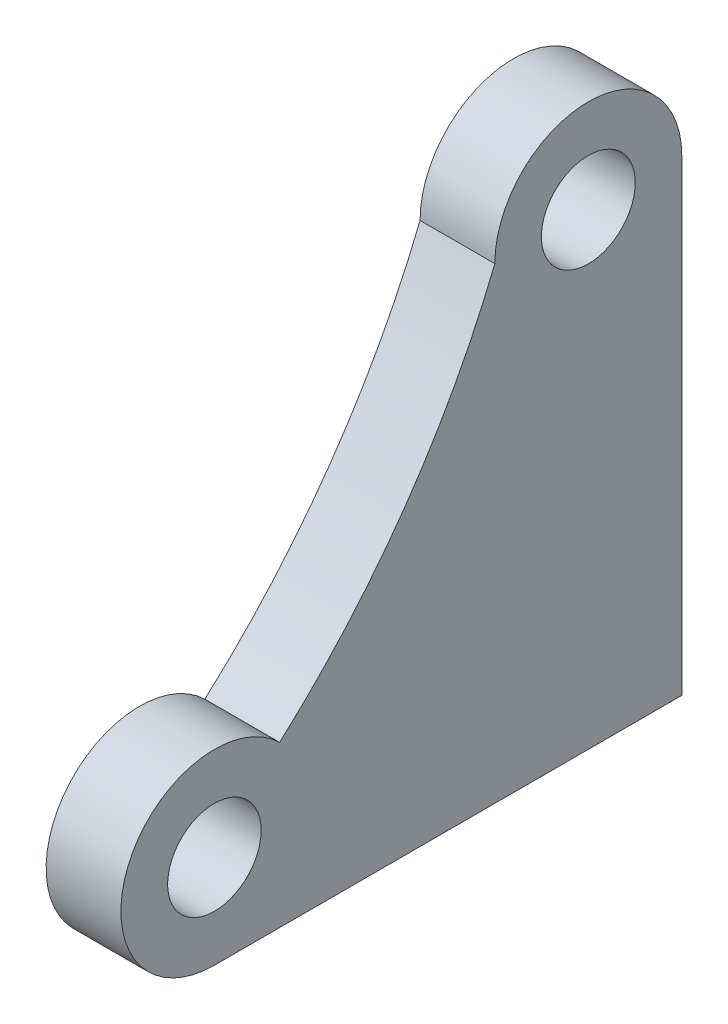
ISO-10303-21;
HEADER;
FILE_DESCRIPTION(('STEP AP214'),'2;1');
FILE_NAME('part.step','',(''),(''),'','','');
FILE_SCHEMA(('AUTOMOTIVE_DESIGN { 1 0 10303 214 1 1 1 1 }'));
ENDSEC;
DATA;
#1=APPLICATION_CONTEXT('core data for automotive mechanical design processes');
#2=APPLICATION_PROTOCOL_DEFINITION('international standard','automotive_design',2000,#1);
#3=PRODUCT_CONTEXT('',#1,'mechanical');
#4=PRODUCT('Part','Part','',(#3));
#5=PRODUCT_RELATED_PRODUCT_CATEGORY('part','',(#4));
#6=PRODUCT_DEFINITION_FORMATION('','',#4);
#7=PRODUCT_DEFINITION_CONTEXT('part definition',#1,'design');
#8=PRODUCT_DEFINITION('design','',#6,#7);
#9=PRODUCT_DEFINITION_SHAPE('','',#8);
#10=(LENGTH_UNIT() NAMED_UNIT(*) SI_UNIT(.MILLI.,.METRE.));
#11=(NAMED_UNIT(*) PLANE_ANGLE_UNIT() SI_UNIT($,.RADIAN.));
#12=(NAMED_UNIT(*) SI_UNIT($,.STERADIAN.) SOLID_ANGLE_UNIT());
#13=UNCERTAINTY_MEASURE_WITH_UNIT(LENGTH_MEASURE(1.E-05),#10,'distance_accuracy_value','');
#14=(GEOMETRIC_REPRESENTATION_CONTEXT(3) GLOBAL_UNCERTAINTY_ASSIGNED_CONTEXT((#13)) GLOBAL_UNIT_ASSIGNED_CONTEXT((#10,
#11,#12)) REPRESENTATION_CONTEXT('',''));
#15=CARTESIAN_POINT('',(0.,0.,0.));
#16=DIRECTION('',(0.,0.,1.));
#17=DIRECTION('',(1.,0.,0.));
#18=AXIS2_PLACEMENT_3D('',#15,#16,#17);
#19=CARTESIAN_POINT('',(4.,0.,0.));
#20=DIRECTION('',(1.,0.,0.));
#21=DIRECTION('',(0.,0.,-1.));
#22=AXIS2_PLACEMENT_3D('',#19,#20,#21);
#23=PLANE('',#22);
#24=CARTESIAN_POINT('',(4.,0.,0.));
#25=DIRECTION('',(1.,0.,0.));
#26=DIRECTION('',(0.,0.,-1.));
#27=AXIS2_PLACEMENT_3D('',#24,#25,#26);
#28=CIRCLE('',#27,2.51032650045818);
#29=CARTESIAN_POINT('',(4.,0.,-2.51032650045818));
#30=VERTEX_POINT('',#29);
#31=EDGE_CURVE('E111',#30,#30,#28,.T.);
#32=ORIENTED_EDGE('',*,*,#31,.F.);
#33=EDGE_LOOP('',(#32));
#34=FACE_BOUND('',#33,.T.);
#35=CARTESIAN_POINT('',(4.,0.,0.));
#36=DIRECTION('',(1.,0.,0.));
#37=DIRECTION('',(0.,0.,-1.));
#38=AXIS2_PLACEMENT_3D('',#35,#36,#37);
#39=CIRCLE('',#38,5.);
#40=CARTESIAN_POINT('',(4.,0.,-5.));
#41=VERTEX_POINT('',#40);
#42=CARTESIAN_POINT('',(4.,0.,5.00000000000001));
#43=VERTEX_POINT('',#42);
#44=EDGE_CURVE('E116',#41,#43,#39,.T.);
#45=ORIENTED_EDGE('',*,*,#44,.T.);
#46=CARTESIAN_POINT('',(4.,16.5698140010008,46.0991836790016));
#47=DIRECTION('',(-1.,0.,0.));
#48=DIRECTION('',(0.,0.,-1.));
#49=AXIS2_PLACEMENT_3D('',#46,#47,#48);
#50=CIRCLE('',#49,44.3136732296937);
#51=CARTESIAN_POINT('',(4.,-16.4186135847368,16.5109211323663));
#52=VERTEX_POINT('',#51);
#53=EDGE_CURVE('E83',#43,#52,#50,.T.);
#54=ORIENTED_EDGE('',*,*,#53,.T.);
#55=CARTESIAN_POINT('',(4.,-20.,20.));
#56=DIRECTION('',(1.,0.,0.));
#57=DIRECTION('',(0.,0.,-1.));
#58=AXIS2_PLACEMENT_3D('',#55,#56,#57);
#59=CIRCLE('',#58,5.);
#60=CARTESIAN_POINT('',(4.,-25.,20.));
#61=VERTEX_POINT('',#60);
#62=EDGE_CURVE('E87',#52,#61,#59,.T.);
#63=ORIENTED_EDGE('',*,*,#62,.T.);
#64=DIRECTION('',(0.,0.,-1.));
#65=VECTOR('',#64,1.);
#66=CARTESIAN_POINT('',(4.,-25.,-5.));
#67=LINE('',#66,#65);
#68=CARTESIAN_POINT('',(4.,-25.,-5.));
#69=VERTEX_POINT('',#68);
#70=EDGE_CURVE('E91',#61,#69,#67,.T.);
#71=ORIENTED_EDGE('',*,*,#70,.T.);
#72=DIRECTION('',(0.,1.,0.));
#73=VECTOR('',#72,1.);
#74=CARTESIAN_POINT('',(4.,0.,-5.));
#75=LINE('',#74,#73);
#76=EDGE_CURVE('E49',#69,#41,#75,.T.);
#77=ORIENTED_EDGE('',*,*,#76,.T.);
#78=EDGE_LOOP('',(#45,#54,#63,#71,#77));
#79=FACE_BOUND('',#78,.T.);
#80=CARTESIAN_POINT('',(4.,-20.,20.));
#81=DIRECTION('',(1.,0.,0.));
#82=DIRECTION('',(0.,0.,-1.));
#83=AXIS2_PLACEMENT_3D('',#80,#81,#82);
#84=CIRCLE('',#83,2.5);
#85=CARTESIAN_POINT('',(4.,-20.,17.5));
#86=VERTEX_POINT('',#85);
#87=EDGE_CURVE('E154',#86,#86,#84,.T.);
#88=ORIENTED_EDGE('',*,*,#87,.F.);
#89=EDGE_LOOP('',(#88));
#90=FACE_BOUND('',#89,.T.);
#91=ADVANCED_FACE('F32',(#34,#79,#90),#23,.T.);
#92=CARTESIAN_POINT('',(0.,0.,0.));
#93=DIRECTION('',(1.,0.,0.));
#94=DIRECTION('',(0.,0.,-1.));
#95=AXIS2_PLACEMENT_3D('',#92,#93,#94);
#96=PLANE('',#95);
#97=CARTESIAN_POINT('',(0.,0.,0.));
#98=DIRECTION('',(1.,0.,0.));
#99=DIRECTION('',(0.,0.,-1.));
#100=AXIS2_PLACEMENT_3D('',#97,#98,#99);
#101=CIRCLE('',#100,2.51032650045818);
#102=CARTESIAN_POINT('',(0.,0.,-2.51032650045818));
#103=VERTEX_POINT('',#102);
#104=EDGE_CURVE('E159',#103,#103,#101,.T.);
#105=ORIENTED_EDGE('',*,*,#104,.T.);
#106=EDGE_LOOP('',(#105));
#107=FACE_BOUND('',#106,.T.);
#108=CARTESIAN_POINT('',(0.,0.,0.));
#109=DIRECTION('',(1.,0.,0.));
#110=DIRECTION('',(0.,0.,-1.));
#111=AXIS2_PLACEMENT_3D('',#108,#109,#110);
#112=CIRCLE('',#111,5.);
#113=CARTESIAN_POINT('',(0.,0.,-5.));
#114=VERTEX_POINT('',#113);
#115=CARTESIAN_POINT('',(0.,0.,5.00000000000001));
#116=VERTEX_POINT('',#115);
#117=EDGE_CURVE('E107',#114,#116,#112,.T.);
#118=ORIENTED_EDGE('',*,*,#117,.F.);
#119=DIRECTION('',(0.,1.,0.));
#120=VECTOR('',#119,1.);
#121=CARTESIAN_POINT('',(0.,0.,-5.));
#122=LINE('',#121,#120);
#123=CARTESIAN_POINT('',(0.,-25.,-5.));
#124=VERTEX_POINT('',#123);
#125=EDGE_CURVE('E75',#124,#114,#122,.T.);
#126=ORIENTED_EDGE('',*,*,#125,.F.);
#127=DIRECTION('',(0.,0.,-1.));
#128=VECTOR('',#127,1.);
#129=CARTESIAN_POINT('',(0.,-25.,-5.));
#130=LINE('',#129,#128);
#131=CARTESIAN_POINT('',(0.,-25.,20.));
#132=VERTEX_POINT('',#131);
#133=EDGE_CURVE('E69',#132,#124,#130,.T.);
#134=ORIENTED_EDGE('',*,*,#133,.F.);
#135=CARTESIAN_POINT('',(0.,-20.,20.));
#136=DIRECTION('',(1.,0.,0.));
#137=DIRECTION('',(0.,0.,-1.));
#138=AXIS2_PLACEMENT_3D('',#135,#136,#137);
#139=CIRCLE('',#138,5.);
#140=CARTESIAN_POINT('',(0.,-16.4186135847368,16.5109211323663));
#141=VERTEX_POINT('',#140);
#142=EDGE_CURVE('E98',#141,#132,#139,.T.);
#143=ORIENTED_EDGE('',*,*,#142,.F.);
#144=CARTESIAN_POINT('',(0.,16.5698140010008,46.0991836790016));
#145=DIRECTION('',(-1.,0.,0.));
#146=DIRECTION('',(0.,0.,-1.));
#147=AXIS2_PLACEMENT_3D('',#144,#145,#146);
#148=CIRCLE('',#147,44.3136732296937);
#149=EDGE_CURVE('E110',#116,#141,#148,.T.);
#150=ORIENTED_EDGE('',*,*,#149,.F.);
#151=EDGE_LOOP('',(#118,#126,#134,#143,#150));
#152=FACE_BOUND('',#151,.T.);
#153=CARTESIAN_POINT('',(0.,-20.,20.));
#154=DIRECTION('',(1.,0.,0.));
#155=DIRECTION('',(0.,0.,-1.));
#156=AXIS2_PLACEMENT_3D('',#153,#154,#155);
#157=CIRCLE('',#156,2.5);
#158=CARTESIAN_POINT('',(0.,-20.,17.5));
#159=VERTEX_POINT('',#158);
#160=EDGE_CURVE('E157',#159,#159,#157,.T.);
#161=ORIENTED_EDGE('',*,*,#160,.T.);
#162=EDGE_LOOP('',(#161));
#163=FACE_BOUND('',#162,.T.);
#164=ADVANCED_FACE('F120',(#107,#152,#163),#96,.F.);
#165=CARTESIAN_POINT('',(4.,0.,0.));
#166=DIRECTION('',(-1.,0.,0.));
#167=DIRECTION('',(0.,0.,1.));
#168=AXIS2_PLACEMENT_3D('',#165,#166,#167);
#169=CYLINDRICAL_SURFACE('',#168,5.);
#170=ORIENTED_EDGE('',*,*,#117,.T.);
#171=DIRECTION('',(-1.,0.,0.));
#172=VECTOR('',#171,1.);
#173=CARTESIAN_POINT('',(4.,0.,5.00000000000001));
#174=LINE('',#173,#172);
#175=EDGE_CURVE('E11',#43,#116,#174,.T.);
#176=ORIENTED_EDGE('',*,*,#175,.F.);
#177=ORIENTED_EDGE('',*,*,#44,.F.);
#178=DIRECTION('',(-1.,0.,0.));
#179=VECTOR('',#178,1.);
#180=CARTESIAN_POINT('',(4.,0.,-5.));
#181=LINE('',#180,#179);
#182=EDGE_CURVE('E103',#41,#114,#181,.T.);
#183=ORIENTED_EDGE('',*,*,#182,.T.);
#184=EDGE_LOOP('',(#170,#176,#177,#183));
#185=FACE_BOUND('',#184,.T.);
#186=ADVANCED_FACE('F34',(#185),#169,.T.);
#187=CARTESIAN_POINT('',(4.,16.5698140010008,46.0991836790016));
#188=DIRECTION('',(-1.,0.,0.));
#189=DIRECTION('',(0.,0.,1.));
#190=AXIS2_PLACEMENT_3D('',#187,#188,#189);
#191=CYLINDRICAL_SURFACE('',#190,44.3136732296937);
#192=ORIENTED_EDGE('',*,*,#149,.T.);
#193=DIRECTION('',(-1.,0.,0.));
#194=VECTOR('',#193,1.);
#195=CARTESIAN_POINT('',(4.,-16.4186135847368,16.5109211323663));
#196=LINE('',#195,#194);
#197=EDGE_CURVE('E41',#52,#141,#196,.T.);
#198=ORIENTED_EDGE('',*,*,#197,.F.);
#199=ORIENTED_EDGE('',*,*,#53,.F.);
#200=ORIENTED_EDGE('',*,*,#175,.T.);
#201=EDGE_LOOP('',(#192,#198,#199,#200));
#202=FACE_BOUND('',#201,.T.);
#203=ADVANCED_FACE('F191',(#202),#191,.F.);
#204=CARTESIAN_POINT('',(4.,-20.,20.));
#205=DIRECTION('',(-1.,0.,0.));
#206=DIRECTION('',(0.,0.,1.));
#207=AXIS2_PLACEMENT_3D('',#204,#205,#206);
#208=CYLINDRICAL_SURFACE('',#207,5.);
#209=ORIENTED_EDGE('',*,*,#142,.T.);
#210=DIRECTION('',(-1.,0.,0.));
#211=VECTOR('',#210,1.);
#212=CARTESIAN_POINT('',(4.,-25.,20.));
#213=LINE('',#212,#211);
#214=EDGE_CURVE('E95',#61,#132,#213,.T.);
#215=ORIENTED_EDGE('',*,*,#214,.F.);
#216=ORIENTED_EDGE('',*,*,#62,.F.);
#217=ORIENTED_EDGE('',*,*,#197,.T.);
#218=EDGE_LOOP('',(#209,#215,#216,#217));
#219=FACE_BOUND('',#218,.T.);
#220=ADVANCED_FACE('F96',(#219),#208,.T.);
#221=CARTESIAN_POINT('',(4.,-25.,-5.));
#222=DIRECTION('',(0.,1.,0.));
#223=DIRECTION('',(0.,0.,1.));
#224=AXIS2_PLACEMENT_3D('',#221,#222,#223);
#225=PLANE('',#224);
#226=ORIENTED_EDGE('',*,*,#133,.T.);
#227=DIRECTION('',(-1.,0.,0.));
#228=VECTOR('',#227,1.);
#229=CARTESIAN_POINT('',(4.,-25.,-5.));
#230=LINE('',#229,#228);
#231=EDGE_CURVE('E99',#69,#124,#230,.T.);
#232=ORIENTED_EDGE('',*,*,#231,.F.);
#233=ORIENTED_EDGE('',*,*,#70,.F.);
#234=ORIENTED_EDGE('',*,*,#214,.T.);
#235=EDGE_LOOP('',(#226,#232,#233,#234));
#236=FACE_BOUND('',#235,.T.);
#237=ADVANCED_FACE('F101',(#236),#225,.F.);
#238=CARTESIAN_POINT('',(4.,0.,-5.));
#239=DIRECTION('',(0.,0.,1.));
#240=DIRECTION('',(0.,-1.,0.));
#241=AXIS2_PLACEMENT_3D('',#238,#239,#240);
#242=PLANE('',#241);
#243=ORIENTED_EDGE('',*,*,#125,.T.);
#244=ORIENTED_EDGE('',*,*,#182,.F.);
#245=ORIENTED_EDGE('',*,*,#76,.F.);
#246=ORIENTED_EDGE('',*,*,#231,.T.);
#247=EDGE_LOOP('',(#243,#244,#245,#246));
#248=FACE_BOUND('',#247,.T.);
#249=ADVANCED_FACE('F125',(#248),#242,.F.);
#250=CARTESIAN_POINT('',(4.,0.,0.));
#251=DIRECTION('',(-1.,0.,0.));
#252=DIRECTION('',(0.,0.,1.));
#253=AXIS2_PLACEMENT_3D('',#250,#251,#252);
#254=CYLINDRICAL_SURFACE('',#253,2.51032650045818);
#255=ORIENTED_EDGE('',*,*,#31,.T.);
#256=EDGE_LOOP('',(#255));
#257=FACE_BOUND('',#256,.T.);
#258=ORIENTED_EDGE('',*,*,#104,.F.);
#259=EDGE_LOOP('',(#258));
#260=FACE_BOUND('',#259,.T.);
#261=ADVANCED_FACE('F127',(#257,#260),#254,.F.);
#262=CARTESIAN_POINT('',(4.,-20.,20.));
#263=DIRECTION('',(-1.,0.,0.));
#264=DIRECTION('',(0.,0.,1.));
#265=AXIS2_PLACEMENT_3D('',#262,#263,#264);
#266=CYLINDRICAL_SURFACE('',#265,2.5);
#267=ORIENTED_EDGE('',*,*,#87,.T.);
#268=EDGE_LOOP('',(#267));
#269=FACE_BOUND('',#268,.T.);
#270=ORIENTED_EDGE('',*,*,#160,.F.);
#271=EDGE_LOOP('',(#270));
#272=FACE_BOUND('',#271,.T.);
#273=ADVANCED_FACE('F133',(#269,#272),#266,.F.);
#274=CLOSED_SHELL('',(#91,#164,#186,#203,#220,#237,#249,#261,#273));
#275=MANIFOLD_SOLID_BREP('B2',#274);
#276=ADVANCED_BREP_SHAPE_REPRESENTATION('',(#18,#275),#14);
#277=SHAPE_DEFINITION_REPRESENTATION(#9,#276);
ENDSEC;
END-ISO-10303-21;
